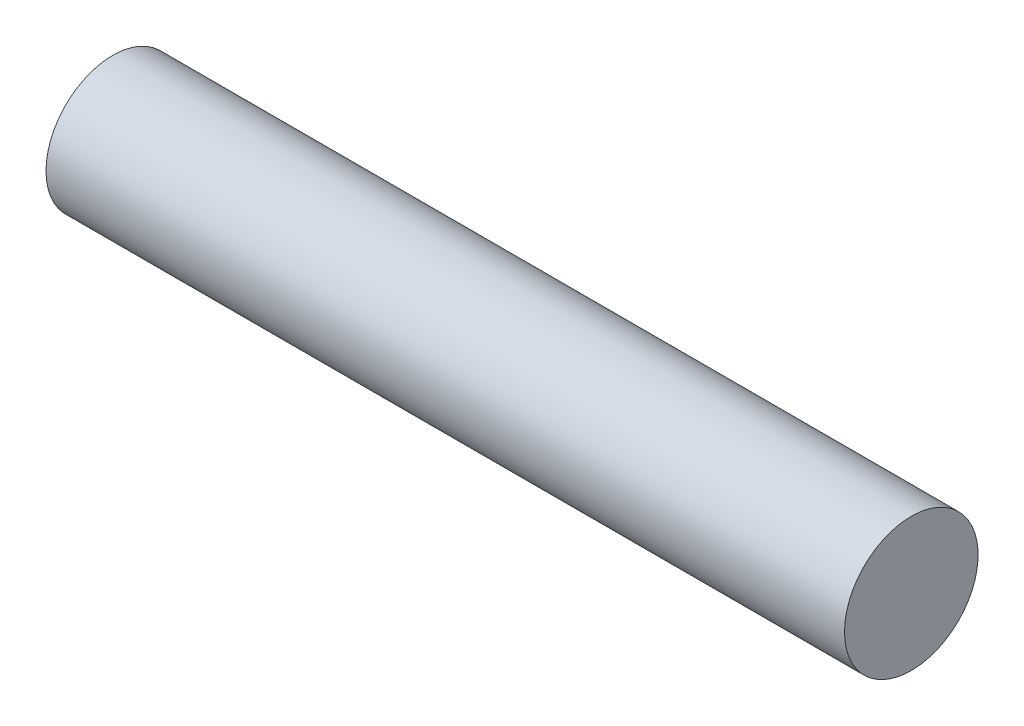
ISO-10303-21;
HEADER;
FILE_DESCRIPTION(('STEP AP214'),'2;1');
FILE_NAME('part.step','',(''),(''),'','','');
FILE_SCHEMA(('AUTOMOTIVE_DESIGN { 1 0 10303 214 1 1 1 1 }'));
ENDSEC;
DATA;
#1=APPLICATION_CONTEXT('core data for automotive mechanical design processes');
#2=APPLICATION_PROTOCOL_DEFINITION('international standard','automotive_design',2000,#1);
#3=PRODUCT_CONTEXT('',#1,'mechanical');
#4=PRODUCT('Part','Part','',(#3));
#5=PRODUCT_RELATED_PRODUCT_CATEGORY('part','',(#4));
#6=PRODUCT_DEFINITION_FORMATION('','',#4);
#7=PRODUCT_DEFINITION_CONTEXT('part definition',#1,'design');
#8=PRODUCT_DEFINITION('design','',#6,#7);
#9=PRODUCT_DEFINITION_SHAPE('','',#8);
#10=(LENGTH_UNIT() NAMED_UNIT(*) SI_UNIT(.MILLI.,.METRE.));
#11=(NAMED_UNIT(*) PLANE_ANGLE_UNIT() SI_UNIT($,.RADIAN.));
#12=(NAMED_UNIT(*) SI_UNIT($,.STERADIAN.) SOLID_ANGLE_UNIT());
#13=UNCERTAINTY_MEASURE_WITH_UNIT(LENGTH_MEASURE(1.E-05),#10,'distance_accuracy_value','');
#14=(GEOMETRIC_REPRESENTATION_CONTEXT(3) GLOBAL_UNCERTAINTY_ASSIGNED_CONTEXT((#13)) GLOBAL_UNIT_ASSIGNED_CONTEXT((#10,
#11,#12)) REPRESENTATION_CONTEXT('',''));
#15=CARTESIAN_POINT('',(0.,0.,0.));
#16=DIRECTION('',(0.,0.,1.));
#17=DIRECTION('',(1.,0.,0.));
#18=AXIS2_PLACEMENT_3D('',#15,#16,#17);
#19=CARTESIAN_POINT('',(60.706,-0.810898935583629,40.5083420136191));
#20=DIRECTION('',(-1.,0.,0.));
#21=DIRECTION('',(0.,0.,1.));
#22=AXIS2_PLACEMENT_3D('',#19,#20,#21);
#23=CYLINDRICAL_SURFACE('',#22,5.08);
#24=CARTESIAN_POINT('',(60.706,-0.810898935583629,40.5083420136191));
#25=DIRECTION('',(1.,0.,0.));
#26=DIRECTION('',(0.,0.,-1.));
#27=AXIS2_PLACEMENT_3D('',#24,#25,#26);
#28=CIRCLE('',#27,5.08);
#29=CARTESIAN_POINT('',(60.706,-0.810898935583629,45.5883420136191));
#30=VERTEX_POINT('',#29);
#31=EDGE_CURVE('E10',#30,#30,#28,.T.);
#32=CARTESIAN_POINT('',(0.,-0.810898935583629,40.5083420136191));
#33=DIRECTION('',(1.,0.,0.));
#34=DIRECTION('',(0.,0.,-1.));
#35=AXIS2_PLACEMENT_3D('',#32,#33,#34);
#36=CIRCLE('',#35,5.08);
#37=CARTESIAN_POINT('',(0.,-0.810898935583629,45.5883420136191));
#38=VERTEX_POINT('',#37);
#39=EDGE_CURVE('E34',#38,#38,#36,.T.);
#40=CARTESIAN_POINT('',(60.706,-0.810898935583629,45.5883420136191));
#41=CARTESIAN_POINT('',(60.0736458333334,-0.810898935583629,45.5883420136191));
#42=CARTESIAN_POINT('',(59.4412916666667,-0.810898935583629,45.5883420136191));
#43=CARTESIAN_POINT('',(58.1765833333333,-0.810898935583629,45.5883420136191));
#44=CARTESIAN_POINT('',(57.5442291666667,-0.810898935583629,45.5883420136191));
#45=CARTESIAN_POINT('',(56.2795208333334,-0.810898935583629,45.5883420136191));
#46=CARTESIAN_POINT('',(55.6471666666667,-0.810898935583629,45.5883420136191));
#47=CARTESIAN_POINT('',(54.3824583333333,-0.810898935583629,45.5883420136191));
#48=CARTESIAN_POINT('',(53.7501041666667,-0.810898935583629,45.5883420136191));
#49=CARTESIAN_POINT('',(52.4853958333333,-0.810898935583629,45.5883420136191));
#50=CARTESIAN_POINT('',(51.8530416666667,-0.810898935583629,45.5883420136191));
#51=CARTESIAN_POINT('',(50.5883333333333,-0.810898935583629,45.5883420136191));
#52=CARTESIAN_POINT('',(49.9559791666667,-0.810898935583629,45.5883420136191));
#53=CARTESIAN_POINT('',(48.6912708333333,-0.810898935583629,45.5883420136191));
#54=CARTESIAN_POINT('',(48.0589166666667,-0.810898935583629,45.5883420136191));
#55=CARTESIAN_POINT('',(46.7942083333334,-0.810898935583629,45.5883420136191));
#56=CARTESIAN_POINT('',(46.1618541666667,-0.810898935583629,45.5883420136191));
#57=CARTESIAN_POINT('',(44.8971458333333,-0.810898935583629,45.5883420136191));
#58=CARTESIAN_POINT('',(44.2647916666667,-0.810898935583629,45.5883420136191));
#59=CARTESIAN_POINT('',(43.0000833333334,-0.810898935583629,45.5883420136191));
#60=CARTESIAN_POINT('',(42.3677291666667,-0.810898935583629,45.5883420136191));
#61=CARTESIAN_POINT('',(41.1030208333334,-0.810898935583629,45.5883420136191));
#62=CARTESIAN_POINT('',(40.4706666666667,-0.810898935583629,45.5883420136191));
#63=CARTESIAN_POINT('',(39.2059583333333,-0.810898935583629,45.5883420136191));
#64=CARTESIAN_POINT('',(38.5736041666667,-0.810898935583629,45.5883420136191));
#65=CARTESIAN_POINT('',(37.3088958333333,-0.810898935583629,45.5883420136191));
#66=CARTESIAN_POINT('',(36.6765416666667,-0.810898935583629,45.5883420136191));
#67=CARTESIAN_POINT('',(35.4118333333333,-0.810898935583629,45.5883420136191));
#68=CARTESIAN_POINT('',(34.7794791666667,-0.810898935583629,45.5883420136191));
#69=CARTESIAN_POINT('',(33.5147708333333,-0.810898935583629,45.5883420136191));
#70=CARTESIAN_POINT('',(32.8824166666667,-0.810898935583629,45.5883420136191));
#71=CARTESIAN_POINT('',(31.6177083333333,-0.810898935583629,45.5883420136191));
#72=CARTESIAN_POINT('',(30.9853541666667,-0.810898935583629,45.5883420136191));
#73=CARTESIAN_POINT('',(29.7206458333333,-0.810898935583629,45.5883420136191));
#74=CARTESIAN_POINT('',(29.0882916666667,-0.810898935583629,45.5883420136191));
#75=CARTESIAN_POINT('',(27.8235833333333,-0.810898935583629,45.5883420136191));
#76=CARTESIAN_POINT('',(27.1912291666667,-0.810898935583629,45.5883420136191));
#77=CARTESIAN_POINT('',(25.9265208333333,-0.810898935583629,45.5883420136191));
#78=CARTESIAN_POINT('',(25.2941666666667,-0.810898935583629,45.5883420136191));
#79=CARTESIAN_POINT('',(24.0294583333333,-0.810898935583629,45.5883420136191));
#80=CARTESIAN_POINT('',(23.3971041666667,-0.810898935583629,45.5883420136191));
#81=CARTESIAN_POINT('',(22.1323958333333,-0.810898935583629,45.5883420136191));
#82=CARTESIAN_POINT('',(21.5000416666667,-0.810898935583629,45.5883420136191));
#83=CARTESIAN_POINT('',(20.2353333333333,-0.810898935583629,45.5883420136191));
#84=CARTESIAN_POINT('',(19.6029791666667,-0.810898935583629,45.5883420136191));
#85=CARTESIAN_POINT('',(18.3382708333333,-0.810898935583629,45.5883420136191));
#86=CARTESIAN_POINT('',(17.7059166666667,-0.810898935583629,45.5883420136191));
#87=CARTESIAN_POINT('',(16.4412083333333,-0.810898935583629,45.5883420136191));
#88=CARTESIAN_POINT('',(15.8088541666667,-0.810898935583629,45.5883420136191));
#89=CARTESIAN_POINT('',(14.5441458333333,-0.810898935583629,45.5883420136191));
#90=CARTESIAN_POINT('',(13.9117916666667,-0.810898935583629,45.5883420136191));
#91=CARTESIAN_POINT('',(12.6470833333333,-0.810898935583629,45.5883420136191));
#92=CARTESIAN_POINT('',(12.0147291666667,-0.810898935583629,45.5883420136191));
#93=CARTESIAN_POINT('',(10.7500208333333,-0.810898935583629,45.5883420136191));
#94=CARTESIAN_POINT('',(10.1176666666667,-0.810898935583629,45.5883420136191));
#95=CARTESIAN_POINT('',(8.85295833333333,-0.810898935583629,45.5883420136191));
#96=CARTESIAN_POINT('',(8.22060416666666,-0.810898935583629,45.5883420136191));
#97=CARTESIAN_POINT('',(6.95589583333333,-0.810898935583629,45.5883420136191));
#98=CARTESIAN_POINT('',(6.32354166666666,-0.810898935583629,45.5883420136191));
#99=CARTESIAN_POINT('',(5.05883333333333,-0.810898935583629,45.5883420136191));
#100=CARTESIAN_POINT('',(4.42647916666666,-0.810898935583629,45.5883420136191));
#101=CARTESIAN_POINT('',(3.16177083333333,-0.810898935583629,45.5883420136191));
#102=CARTESIAN_POINT('',(2.52941666666666,-0.810898935583629,45.5883420136191));
#103=CARTESIAN_POINT('',(1.26470833333332,-0.810898935583629,45.5883420136191));
#104=CARTESIAN_POINT('',(0.632354166666659,-0.810898935583629,45.5883420136191));
#105=CARTESIAN_POINT('',(0.,-0.810898935583629,45.5883420136191));
#106=B_SPLINE_CURVE_WITH_KNOTS('',3,(#40,#41,#42,#43,#44,#45,#46,#47,#48,#49,#50,#51,#52,#53,
#54,#55,#56,#57,#58,#59,#60,#61,#62,#63,#64,#65,#66,#67,#68,#69,#70,#71,#72,#73,#74,#75,#76,#77,
#78,#79,#80,#81,#82,#83,#84,#85,#86,#87,#88,#89,#90,#91,#92,#93,#94,#95,#96,#97,#98,#99,#100,
#101,#102,#103,#104,#105),.UNSPECIFIED.,.F.,.F.,(4,2,2,2,2,2,2,2,2,2,2,2,2,2,2,2,2,2,2,2,2,2,2,
2,2,2,2,2,2,2,2,2,4),(0.,1.8970625,3.794125,5.6911875,7.58825,9.4853125,11.382375,13.2794375,
15.1765,17.0735625,18.970625,20.8676875,22.76475,24.6618125,26.558875,28.4559375,30.353,
32.2500625,34.147125,36.0441875,37.94125,39.8383125,41.735375,43.6324375,45.5295,47.4265625,
49.323625,51.2206875,53.11775,55.0148125,56.911875,58.8089375,60.706),.UNSPECIFIED.);
#107=EDGE_CURVE('BSEAM31',#30,#38,#106,.T.);
#108=ORIENTED_EDGE('',*,*,#31,.F.);
#109=ORIENTED_EDGE('',*,*,#39,.T.);
#110=ORIENTED_EDGE('',*,*,#107,.T.);
#111=ORIENTED_EDGE('',*,*,#107,.F.);
#112=EDGE_LOOP('',(#108,#110,#109,#111));
#113=FACE_BOUND('',#112,.T.);
#114=ADVANCED_FACE('F31',(#113),#23,.T.);
#115=CARTESIAN_POINT('',(60.706,-0.810898935583629,40.5083420136191));
#116=DIRECTION('',(1.,0.,0.));
#117=DIRECTION('',(0.,0.,-1.));
#118=AXIS2_PLACEMENT_3D('',#115,#116,#117);
#119=PLANE('',#118);
#120=ORIENTED_EDGE('',*,*,#31,.T.);
#121=EDGE_LOOP('',(#120));
#122=FACE_BOUND('',#121,.T.);
#123=ADVANCED_FACE('F46',(#122),#119,.T.);
#124=CARTESIAN_POINT('',(0.,-0.810898935583629,40.5083420136191));
#125=DIRECTION('',(1.,0.,0.));
#126=DIRECTION('',(0.,0.,-1.));
#127=AXIS2_PLACEMENT_3D('',#124,#125,#126);
#128=PLANE('',#127);
#129=ORIENTED_EDGE('',*,*,#39,.F.);
#130=EDGE_LOOP('',(#129));
#131=FACE_BOUND('',#130,.T.);
#132=ADVANCED_FACE('F44',(#131),#128,.F.);
#133=CLOSED_SHELL('',(#114,#123,#132));
#134=MANIFOLD_SOLID_BREP('B2',#133);
#135=ADVANCED_BREP_SHAPE_REPRESENTATION('',(#18,#134),#14);
#136=SHAPE_DEFINITION_REPRESENTATION(#9,#135);
ENDSEC;
END-ISO-10303-21;
